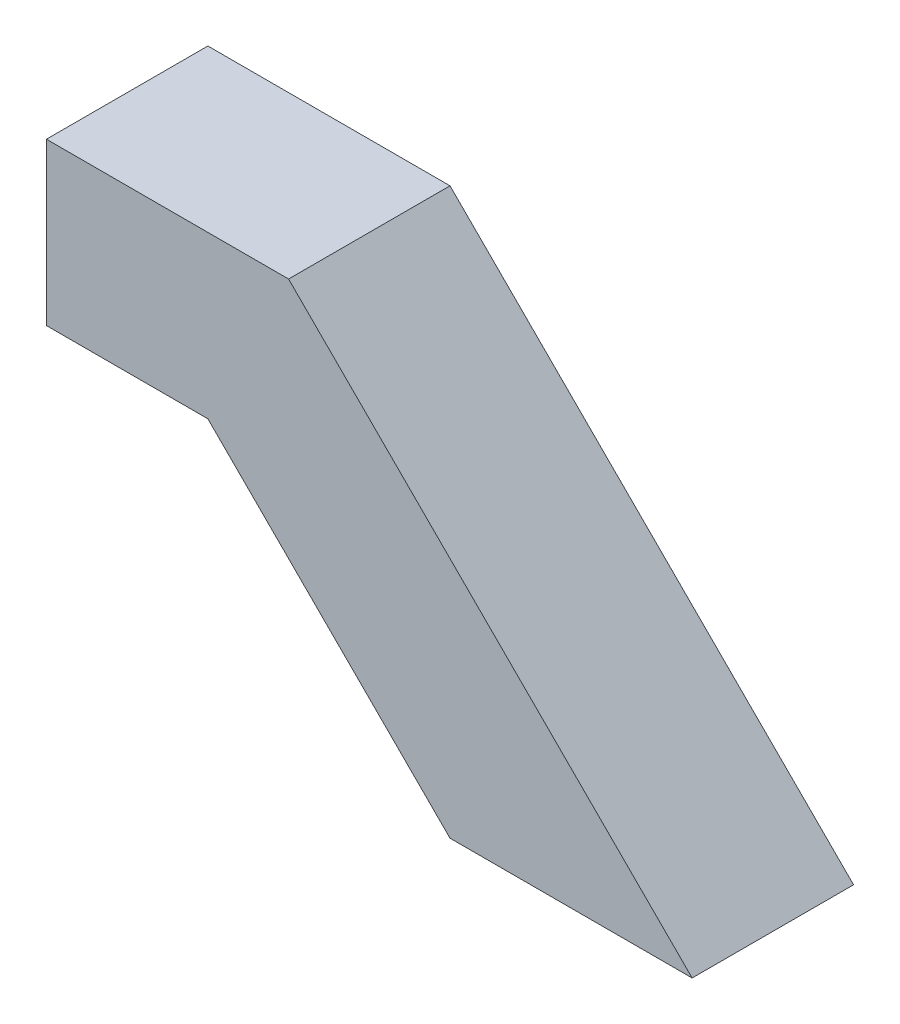
ISO-10303-21;
HEADER;
FILE_DESCRIPTION(('STEP AP214'),'2;1');
FILE_NAME('part.step','',(''),(''),'','','');
FILE_SCHEMA(('AUTOMOTIVE_DESIGN { 1 0 10303 214 1 1 1 1 }'));
ENDSEC;
DATA;
#1=APPLICATION_CONTEXT('core data for automotive mechanical design processes');
#2=APPLICATION_PROTOCOL_DEFINITION('international standard','automotive_design',2000,#1);
#3=PRODUCT_CONTEXT('',#1,'mechanical');
#4=PRODUCT('Part','Part','',(#3));
#5=PRODUCT_RELATED_PRODUCT_CATEGORY('part','',(#4));
#6=PRODUCT_DEFINITION_FORMATION('','',#4);
#7=PRODUCT_DEFINITION_CONTEXT('part definition',#1,'design');
#8=PRODUCT_DEFINITION('design','',#6,#7);
#9=PRODUCT_DEFINITION_SHAPE('','',#8);
#10=(LENGTH_UNIT() NAMED_UNIT(*) SI_UNIT(.MILLI.,.METRE.));
#11=(NAMED_UNIT(*) PLANE_ANGLE_UNIT() SI_UNIT($,.RADIAN.));
#12=(NAMED_UNIT(*) SI_UNIT($,.STERADIAN.) SOLID_ANGLE_UNIT());
#13=UNCERTAINTY_MEASURE_WITH_UNIT(LENGTH_MEASURE(1.E-05),#10,'distance_accuracy_value','');
#14=(GEOMETRIC_REPRESENTATION_CONTEXT(3) GLOBAL_UNCERTAINTY_ASSIGNED_CONTEXT((#13)) GLOBAL_UNIT_ASSIGNED_CONTEXT((#10,
#11,#12)) REPRESENTATION_CONTEXT('',''));
#15=CARTESIAN_POINT('',(0.,0.,0.));
#16=DIRECTION('',(0.,0.,1.));
#17=DIRECTION('',(1.,0.,0.));
#18=AXIS2_PLACEMENT_3D('',#15,#16,#17);
#19=CARTESIAN_POINT('',(0.,0.,20.));
#20=DIRECTION('',(0.,1.,0.));
#21=DIRECTION('',(0.,0.,1.));
#22=AXIS2_PLACEMENT_3D('',#19,#20,#21);
#23=PLANE('',#22);
#24=DIRECTION('',(1.,0.,0.));
#25=VECTOR('',#24,1.);
#26=CARTESIAN_POINT('',(0.,0.,0.));
#27=LINE('',#26,#25);
#28=CARTESIAN_POINT('',(0.,0.,0.));
#29=VERTEX_POINT('',#28);
#30=CARTESIAN_POINT('',(20.,0.,0.));
#31=VERTEX_POINT('',#30);
#32=EDGE_CURVE('E134',#29,#31,#27,.T.);
#33=ORIENTED_EDGE('',*,*,#32,.T.);
#34=DIRECTION('',(0.,0.,-1.));
#35=VECTOR('',#34,1.);
#36=CARTESIAN_POINT('',(20.,0.,20.));
#37=LINE('',#36,#35);
#38=CARTESIAN_POINT('',(20.,0.,20.));
#39=VERTEX_POINT('',#38);
#40=EDGE_CURVE('E11',#39,#31,#37,.T.);
#41=ORIENTED_EDGE('',*,*,#40,.F.);
#42=DIRECTION('',(1.,0.,0.));
#43=VECTOR('',#42,1.);
#44=CARTESIAN_POINT('',(0.,0.,20.));
#45=LINE('',#44,#43);
#46=CARTESIAN_POINT('',(0.,0.,20.));
#47=VERTEX_POINT('',#46);
#48=EDGE_CURVE('E150',#47,#39,#45,.T.);
#49=ORIENTED_EDGE('',*,*,#48,.F.);
#50=DIRECTION('',(0.,0.,-1.));
#51=VECTOR('',#50,1.);
#52=CARTESIAN_POINT('',(0.,0.,20.));
#53=LINE('',#52,#51);
#54=EDGE_CURVE('E130',#47,#29,#53,.T.);
#55=ORIENTED_EDGE('',*,*,#54,.T.);
#56=EDGE_LOOP('',(#33,#41,#49,#55));
#57=FACE_BOUND('',#56,.T.);
#58=ADVANCED_FACE('F45',(#57),#23,.F.);
#59=CARTESIAN_POINT('',(20.,0.,20.));
#60=DIRECTION('',(0.707106781186549,0.707106781186546,0.));
#61=DIRECTION('',(-0.707106781186546,0.707106781186549,0.));
#62=AXIS2_PLACEMENT_3D('',#59,#60,#61);
#63=PLANE('',#62);
#64=DIRECTION('',(0.707106781186546,-0.707106781186549,0.));
#65=VECTOR('',#64,1.);
#66=CARTESIAN_POINT('',(20.,0.,0.));
#67=LINE('',#66,#65);
#68=CARTESIAN_POINT('',(49.9999999999999,-30.,0.));
#69=VERTEX_POINT('',#68);
#70=EDGE_CURVE('E138',#31,#69,#67,.T.);
#71=ORIENTED_EDGE('',*,*,#70,.T.);
#72=DIRECTION('',(0.,0.,-1.));
#73=VECTOR('',#72,1.);
#74=CARTESIAN_POINT('',(49.9999999999999,-30.,20.));
#75=LINE('',#74,#73);
#76=CARTESIAN_POINT('',(49.9999999999999,-30.,20.));
#77=VERTEX_POINT('',#76);
#78=EDGE_CURVE('E54',#77,#69,#75,.T.);
#79=ORIENTED_EDGE('',*,*,#78,.F.);
#80=DIRECTION('',(0.707106781186546,-0.707106781186549,0.));
#81=VECTOR('',#80,1.);
#82=CARTESIAN_POINT('',(20.,0.,20.));
#83=LINE('',#82,#81);
#84=EDGE_CURVE('E99',#39,#77,#83,.T.);
#85=ORIENTED_EDGE('',*,*,#84,.F.);
#86=ORIENTED_EDGE('',*,*,#40,.T.);
#87=EDGE_LOOP('',(#71,#79,#85,#86));
#88=FACE_BOUND('',#87,.T.);
#89=ADVANCED_FACE('F178',(#88),#63,.F.);
#90=CARTESIAN_POINT('',(79.9999999999999,-30.,20.));
#91=DIRECTION('',(0.,1.,0.));
#92=DIRECTION('',(0.,0.,1.));
#93=AXIS2_PLACEMENT_3D('',#90,#91,#92);
#94=PLANE('',#93);
#95=DIRECTION('',(1.,0.,0.));
#96=VECTOR('',#95,1.);
#97=CARTESIAN_POINT('',(79.9999999999999,-30.,0.));
#98=LINE('',#97,#96);
#99=CARTESIAN_POINT('',(79.9999999999999,-30.,0.));
#100=VERTEX_POINT('',#99);
#101=EDGE_CURVE('E141',#69,#100,#98,.T.);
#102=ORIENTED_EDGE('',*,*,#101,.T.);
#103=DIRECTION('',(0.,0.,-1.));
#104=VECTOR('',#103,1.);
#105=CARTESIAN_POINT('',(79.9999999999999,-30.,20.));
#106=LINE('',#105,#104);
#107=CARTESIAN_POINT('',(79.9999999999999,-30.,20.));
#108=VERTEX_POINT('',#107);
#109=EDGE_CURVE('E123',#108,#100,#106,.T.);
#110=ORIENTED_EDGE('',*,*,#109,.F.);
#111=DIRECTION('',(1.,0.,0.));
#112=VECTOR('',#111,1.);
#113=CARTESIAN_POINT('',(79.9999999999999,-30.,20.));
#114=LINE('',#113,#112);
#115=EDGE_CURVE('E112',#77,#108,#114,.T.);
#116=ORIENTED_EDGE('',*,*,#115,.F.);
#117=ORIENTED_EDGE('',*,*,#78,.T.);
#118=EDGE_LOOP('',(#102,#110,#116,#117));
#119=FACE_BOUND('',#118,.T.);
#120=ADVANCED_FACE('F160',(#119),#94,.F.);
#121=CARTESIAN_POINT('',(30.0000000000001,20.,20.));
#122=DIRECTION('',(-0.707106781186549,-0.707106781186546,0.));
#123=DIRECTION('',(0.707106781186546,-0.707106781186549,0.));
#124=AXIS2_PLACEMENT_3D('',#121,#122,#123);
#125=PLANE('',#124);
#126=DIRECTION('',(-0.707106781186546,0.707106781186549,0.));
#127=VECTOR('',#126,1.);
#128=CARTESIAN_POINT('',(30.0000000000001,20.,0.));
#129=LINE('',#128,#127);
#130=CARTESIAN_POINT('',(30.0000000000001,20.,0.));
#131=VERTEX_POINT('',#130);
#132=EDGE_CURVE('E121',#100,#131,#129,.T.);
#133=ORIENTED_EDGE('',*,*,#132,.T.);
#134=DIRECTION('',(0.,0.,-1.));
#135=VECTOR('',#134,1.);
#136=CARTESIAN_POINT('',(30.0000000000001,20.,20.));
#137=LINE('',#136,#135);
#138=CARTESIAN_POINT('',(30.0000000000001,20.,20.));
#139=VERTEX_POINT('',#138);
#140=EDGE_CURVE('E118',#139,#131,#137,.T.);
#141=ORIENTED_EDGE('',*,*,#140,.F.);
#142=DIRECTION('',(-0.707106781186546,0.707106781186549,0.));
#143=VECTOR('',#142,1.);
#144=CARTESIAN_POINT('',(30.0000000000001,20.,20.));
#145=LINE('',#144,#143);
#146=EDGE_CURVE('E106',#108,#139,#145,.T.);
#147=ORIENTED_EDGE('',*,*,#146,.F.);
#148=ORIENTED_EDGE('',*,*,#109,.T.);
#149=EDGE_LOOP('',(#133,#141,#147,#148));
#150=FACE_BOUND('',#149,.T.);
#151=ADVANCED_FACE('F119',(#150),#125,.F.);
#152=CARTESIAN_POINT('',(0.,20.,20.));
#153=DIRECTION('',(0.,-1.,0.));
#154=DIRECTION('',(0.,0.,-1.));
#155=AXIS2_PLACEMENT_3D('',#152,#153,#154);
#156=PLANE('',#155);
#157=DIRECTION('',(-1.,0.,0.));
#158=VECTOR('',#157,1.);
#159=CARTESIAN_POINT('',(0.,20.,0.));
#160=LINE('',#159,#158);
#161=CARTESIAN_POINT('',(0.,20.,0.));
#162=VERTEX_POINT('',#161);
#163=EDGE_CURVE('E85',#131,#162,#160,.T.);
#164=ORIENTED_EDGE('',*,*,#163,.T.);
#165=DIRECTION('',(0.,0.,-1.));
#166=VECTOR('',#165,1.);
#167=CARTESIAN_POINT('',(0.,20.,20.));
#168=LINE('',#167,#166);
#169=CARTESIAN_POINT('',(0.,20.,20.));
#170=VERTEX_POINT('',#169);
#171=EDGE_CURVE('E124',#170,#162,#168,.T.);
#172=ORIENTED_EDGE('',*,*,#171,.F.);
#173=DIRECTION('',(-1.,0.,0.));
#174=VECTOR('',#173,1.);
#175=CARTESIAN_POINT('',(0.,20.,20.));
#176=LINE('',#175,#174);
#177=EDGE_CURVE('E110',#139,#170,#176,.T.);
#178=ORIENTED_EDGE('',*,*,#177,.F.);
#179=ORIENTED_EDGE('',*,*,#140,.T.);
#180=EDGE_LOOP('',(#164,#172,#178,#179));
#181=FACE_BOUND('',#180,.T.);
#182=ADVANCED_FACE('F126',(#181),#156,.F.);
#183=CARTESIAN_POINT('',(0.,0.,20.));
#184=DIRECTION('',(1.,0.,0.));
#185=DIRECTION('',(0.,0.,-1.));
#186=AXIS2_PLACEMENT_3D('',#183,#184,#185);
#187=PLANE('',#186);
#188=DIRECTION('',(0.,-1.,0.));
#189=VECTOR('',#188,1.);
#190=CARTESIAN_POINT('',(0.,0.,0.));
#191=LINE('',#190,#189);
#192=EDGE_CURVE('E91',#162,#29,#191,.T.);
#193=ORIENTED_EDGE('',*,*,#192,.T.);
#194=ORIENTED_EDGE('',*,*,#54,.F.);
#195=DIRECTION('',(0.,-1.,0.));
#196=VECTOR('',#195,1.);
#197=CARTESIAN_POINT('',(0.,0.,20.));
#198=LINE('',#197,#196);
#199=EDGE_CURVE('E62',#170,#47,#198,.T.);
#200=ORIENTED_EDGE('',*,*,#199,.F.);
#201=ORIENTED_EDGE('',*,*,#171,.T.);
#202=EDGE_LOOP('',(#193,#194,#200,#201));
#203=FACE_BOUND('',#202,.T.);
#204=ADVANCED_FACE('F167',(#203),#187,.F.);
#205=CARTESIAN_POINT('',(0.,0.,20.));
#206=DIRECTION('',(0.,0.,1.));
#207=DIRECTION('',(1.,0.,0.));
#208=AXIS2_PLACEMENT_3D('',#205,#206,#207);
#209=PLANE('',#208);
#210=ORIENTED_EDGE('',*,*,#48,.T.);
#211=ORIENTED_EDGE('',*,*,#84,.T.);
#212=ORIENTED_EDGE('',*,*,#115,.T.);
#213=ORIENTED_EDGE('',*,*,#146,.T.);
#214=ORIENTED_EDGE('',*,*,#177,.T.);
#215=ORIENTED_EDGE('',*,*,#199,.T.);
#216=EDGE_LOOP('',(#210,#211,#212,#213,#214,#215));
#217=FACE_BOUND('',#216,.T.);
#218=ADVANCED_FACE('F108',(#217),#209,.T.);
#219=CARTESIAN_POINT('',(0.,0.,0.));
#220=DIRECTION('',(0.,0.,1.));
#221=DIRECTION('',(1.,0.,0.));
#222=AXIS2_PLACEMENT_3D('',#219,#220,#221);
#223=PLANE('',#222);
#224=ORIENTED_EDGE('',*,*,#32,.F.);
#225=ORIENTED_EDGE('',*,*,#192,.F.);
#226=ORIENTED_EDGE('',*,*,#163,.F.);
#227=ORIENTED_EDGE('',*,*,#132,.F.);
#228=ORIENTED_EDGE('',*,*,#101,.F.);
#229=ORIENTED_EDGE('',*,*,#70,.F.);
#230=EDGE_LOOP('',(#224,#225,#226,#227,#228,#229));
#231=FACE_BOUND('',#230,.T.);
#232=ADVANCED_FACE('F163',(#231),#223,.F.);
#233=CLOSED_SHELL('',(#58,#89,#120,#151,#182,#204,#218,#232));
#234=MANIFOLD_SOLID_BREP('B2',#233);
#235=ADVANCED_BREP_SHAPE_REPRESENTATION('',(#18,#234),#14);
#236=SHAPE_DEFINITION_REPRESENTATION(#9,#235);
ENDSEC;
END-ISO-10303-21;
